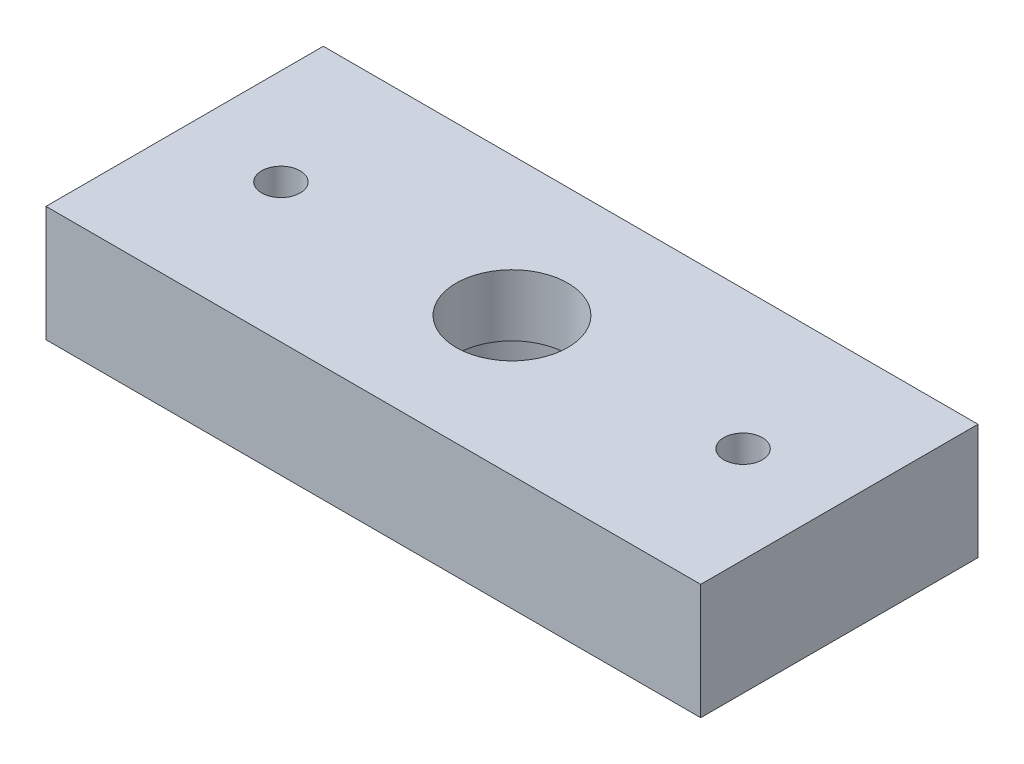
ISO-10303-21;
HEADER;
FILE_DESCRIPTION(('STEP AP214'),'2;1');
FILE_NAME('part.step','',(''),(''),'','','');
FILE_SCHEMA(('AUTOMOTIVE_DESIGN { 1 0 10303 214 1 1 1 1 }'));
ENDSEC;
DATA;
#1=APPLICATION_CONTEXT('core data for automotive mechanical design processes');
#2=APPLICATION_PROTOCOL_DEFINITION('international standard','automotive_design',2000,#1);
#3=PRODUCT_CONTEXT('',#1,'mechanical');
#4=PRODUCT('Part','Part','',(#3));
#5=PRODUCT_RELATED_PRODUCT_CATEGORY('part','',(#4));
#6=PRODUCT_DEFINITION_FORMATION('','',#4);
#7=PRODUCT_DEFINITION_CONTEXT('part definition',#1,'design');
#8=PRODUCT_DEFINITION('design','',#6,#7);
#9=PRODUCT_DEFINITION_SHAPE('','',#8);
#10=(LENGTH_UNIT() NAMED_UNIT(*) SI_UNIT(.MILLI.,.METRE.));
#11=(NAMED_UNIT(*) PLANE_ANGLE_UNIT() SI_UNIT($,.RADIAN.));
#12=(NAMED_UNIT(*) SI_UNIT($,.STERADIAN.) SOLID_ANGLE_UNIT());
#13=UNCERTAINTY_MEASURE_WITH_UNIT(LENGTH_MEASURE(1.E-05),#10,'distance_accuracy_value','');
#14=(GEOMETRIC_REPRESENTATION_CONTEXT(3) GLOBAL_UNCERTAINTY_ASSIGNED_CONTEXT((#13)) GLOBAL_UNIT_ASSIGNED_CONTEXT((#10,
#11,#12)) REPRESENTATION_CONTEXT('',''));
#15=CARTESIAN_POINT('',(0.,0.,0.));
#16=DIRECTION('',(0.,0.,1.));
#17=DIRECTION('',(1.,0.,0.));
#18=AXIS2_PLACEMENT_3D('',#15,#16,#17);
#19=CARTESIAN_POINT('',(42.5,15.,0.));
#20=DIRECTION('',(1.,0.,0.));
#21=DIRECTION('',(0.,0.,-1.));
#22=AXIS2_PLACEMENT_3D('',#19,#20,#21);
#23=PLANE('',#22);
#24=DIRECTION('',(0.,0.,1.));
#25=VECTOR('',#24,1.);
#26=CARTESIAN_POINT('',(42.5,0.,0.));
#27=LINE('',#26,#25);
#28=CARTESIAN_POINT('',(42.5,0.,-18.));
#29=VERTEX_POINT('',#28);
#30=CARTESIAN_POINT('',(42.5,0.,18.));
#31=VERTEX_POINT('',#30);
#32=EDGE_CURVE('E117',#29,#31,#27,.T.);
#33=ORIENTED_EDGE('',*,*,#32,.F.);
#34=DIRECTION('',(0.,-1.,0.));
#35=VECTOR('',#34,1.);
#36=CARTESIAN_POINT('',(42.5,15.,-18.));
#37=LINE('',#36,#35);
#38=CARTESIAN_POINT('',(42.5,15.,-18.));
#39=VERTEX_POINT('',#38);
#40=EDGE_CURVE('E11',#39,#29,#37,.T.);
#41=ORIENTED_EDGE('',*,*,#40,.F.);
#42=DIRECTION('',(0.,0.,1.));
#43=VECTOR('',#42,1.);
#44=CARTESIAN_POINT('',(42.5,15.,0.));
#45=LINE('',#44,#43);
#46=CARTESIAN_POINT('',(42.5,15.,18.));
#47=VERTEX_POINT('',#46);
#48=EDGE_CURVE('E101',#39,#47,#45,.T.);
#49=ORIENTED_EDGE('',*,*,#48,.T.);
#50=DIRECTION('',(0.,-1.,0.));
#51=VECTOR('',#50,1.);
#52=CARTESIAN_POINT('',(42.5,15.,18.));
#53=LINE('',#52,#51);
#54=EDGE_CURVE('E80',#47,#31,#53,.T.);
#55=ORIENTED_EDGE('',*,*,#54,.T.);
#56=EDGE_LOOP('',(#33,#41,#49,#55));
#57=FACE_BOUND('',#56,.T.);
#58=ADVANCED_FACE('F41',(#57),#23,.T.);
#59=CARTESIAN_POINT('',(0.,15.,-18.));
#60=DIRECTION('',(0.,0.,-1.));
#61=DIRECTION('',(-1.,0.,0.));
#62=AXIS2_PLACEMENT_3D('',#59,#60,#61);
#63=PLANE('',#62);
#64=DIRECTION('',(1.,0.,0.));
#65=VECTOR('',#64,1.);
#66=CARTESIAN_POINT('',(0.,0.,-18.));
#67=LINE('',#66,#65);
#68=CARTESIAN_POINT('',(-42.5,0.,-18.));
#69=VERTEX_POINT('',#68);
#70=EDGE_CURVE('E93',#69,#29,#67,.T.);
#71=ORIENTED_EDGE('',*,*,#70,.F.);
#72=DIRECTION('',(0.,-1.,0.));
#73=VECTOR('',#72,1.);
#74=CARTESIAN_POINT('',(-42.5,15.,-18.));
#75=LINE('',#74,#73);
#76=CARTESIAN_POINT('',(-42.5,15.,-18.));
#77=VERTEX_POINT('',#76);
#78=EDGE_CURVE('E50',#77,#69,#75,.T.);
#79=ORIENTED_EDGE('',*,*,#78,.F.);
#80=DIRECTION('',(1.,0.,0.));
#81=VECTOR('',#80,1.);
#82=CARTESIAN_POINT('',(0.,15.,-18.));
#83=LINE('',#82,#81);
#84=EDGE_CURVE('E91',#77,#39,#83,.T.);
#85=ORIENTED_EDGE('',*,*,#84,.T.);
#86=ORIENTED_EDGE('',*,*,#40,.T.);
#87=EDGE_LOOP('',(#71,#79,#85,#86));
#88=FACE_BOUND('',#87,.T.);
#89=ADVANCED_FACE('F89',(#88),#63,.T.);
#90=CARTESIAN_POINT('',(-42.5,15.,0.));
#91=DIRECTION('',(1.,0.,0.));
#92=DIRECTION('',(0.,0.,-1.));
#93=AXIS2_PLACEMENT_3D('',#90,#91,#92);
#94=PLANE('',#93);
#95=DIRECTION('',(0.,0.,1.));
#96=VECTOR('',#95,1.);
#97=CARTESIAN_POINT('',(-42.5,0.,0.));
#98=LINE('',#97,#96);
#99=CARTESIAN_POINT('',(-42.5,0.,18.));
#100=VERTEX_POINT('',#99);
#101=EDGE_CURVE('E73',#69,#100,#98,.T.);
#102=ORIENTED_EDGE('',*,*,#101,.T.);
#103=DIRECTION('',(0.,-1.,0.));
#104=VECTOR('',#103,1.);
#105=CARTESIAN_POINT('',(-42.5,15.,18.));
#106=LINE('',#105,#104);
#107=CARTESIAN_POINT('',(-42.5,15.,18.));
#108=VERTEX_POINT('',#107);
#109=EDGE_CURVE('E94',#108,#100,#106,.T.);
#110=ORIENTED_EDGE('',*,*,#109,.F.);
#111=DIRECTION('',(0.,0.,1.));
#112=VECTOR('',#111,1.);
#113=CARTESIAN_POINT('',(-42.5,15.,0.));
#114=LINE('',#113,#112);
#115=EDGE_CURVE('E96',#77,#108,#114,.T.);
#116=ORIENTED_EDGE('',*,*,#115,.F.);
#117=ORIENTED_EDGE('',*,*,#78,.T.);
#118=EDGE_LOOP('',(#102,#110,#116,#117));
#119=FACE_BOUND('',#118,.T.);
#120=ADVANCED_FACE('F97',(#119),#94,.F.);
#121=CARTESIAN_POINT('',(-30.,15.,0.));
#122=DIRECTION('',(0.,-1.,0.));
#123=DIRECTION('',(0.,0.,-1.));
#124=AXIS2_PLACEMENT_3D('',#121,#122,#123);
#125=CYLINDRICAL_SURFACE('',#124,2.5);
#126=CARTESIAN_POINT('',(-30.,15.,0.));
#127=DIRECTION('',(0.,1.,0.));
#128=DIRECTION('',(0.,0.,1.));
#129=AXIS2_PLACEMENT_3D('',#126,#127,#128);
#130=CIRCLE('',#129,2.5);
#131=CARTESIAN_POINT('',(-30.,15.,2.50000000000001));
#132=VERTEX_POINT('',#131);
#133=EDGE_CURVE('E111',#132,#132,#130,.T.);
#134=ORIENTED_EDGE('',*,*,#133,.T.);
#135=EDGE_LOOP('',(#134));
#136=FACE_BOUND('',#135,.T.);
#137=CARTESIAN_POINT('',(-30.,0.,0.));
#138=DIRECTION('',(0.,1.,0.));
#139=DIRECTION('',(0.,0.,1.));
#140=AXIS2_PLACEMENT_3D('',#137,#138,#139);
#141=CIRCLE('',#140,2.5);
#142=CARTESIAN_POINT('',(-30.,0.,2.50000000000001));
#143=VERTEX_POINT('',#142);
#144=EDGE_CURVE('E124',#143,#143,#141,.T.);
#145=ORIENTED_EDGE('',*,*,#144,.F.);
#146=EDGE_LOOP('',(#145));
#147=FACE_BOUND('',#146,.T.);
#148=ADVANCED_FACE('F143',(#136,#147),#125,.F.);
#149=CARTESIAN_POINT('',(0.,15.,0.));
#150=DIRECTION('',(0.,-1.,0.));
#151=DIRECTION('',(0.,0.,-1.));
#152=AXIS2_PLACEMENT_3D('',#149,#150,#151);
#153=CYLINDRICAL_SURFACE('',#152,7.25);
#154=CARTESIAN_POINT('',(0.,7.,0.));
#155=DIRECTION('',(0.,1.,0.));
#156=DIRECTION('',(0.,0.,1.));
#157=AXIS2_PLACEMENT_3D('',#154,#155,#156);
#158=CIRCLE('',#157,7.25);
#159=CARTESIAN_POINT('',(0.,7.,7.25));
#160=VERTEX_POINT('',#159);
#161=EDGE_CURVE('E44',#160,#160,#158,.T.);
#162=ORIENTED_EDGE('',*,*,#161,.F.);
#163=EDGE_LOOP('',(#162));
#164=FACE_BOUND('',#163,.T.);
#165=CARTESIAN_POINT('',(0.,15.,0.));
#166=DIRECTION('',(0.,1.,0.));
#167=DIRECTION('',(0.,0.,1.));
#168=AXIS2_PLACEMENT_3D('',#165,#166,#167);
#169=CIRCLE('',#168,7.25);
#170=CARTESIAN_POINT('',(0.,15.,7.25));
#171=VERTEX_POINT('',#170);
#172=EDGE_CURVE('E108',#171,#171,#169,.T.);
#173=ORIENTED_EDGE('',*,*,#172,.T.);
#174=EDGE_LOOP('',(#173));
#175=FACE_BOUND('',#174,.T.);
#176=ADVANCED_FACE('F149',(#164,#175),#153,.F.);
#177=CARTESIAN_POINT('',(0.,15.,18.));
#178=DIRECTION('',(0.,0.,-1.));
#179=DIRECTION('',(-1.,0.,0.));
#180=AXIS2_PLACEMENT_3D('',#177,#178,#179);
#181=PLANE('',#180);
#182=DIRECTION('',(1.,0.,0.));
#183=VECTOR('',#182,1.);
#184=CARTESIAN_POINT('',(0.,0.,18.));
#185=LINE('',#184,#183);
#186=EDGE_CURVE('E122',#100,#31,#185,.T.);
#187=ORIENTED_EDGE('',*,*,#186,.T.);
#188=ORIENTED_EDGE('',*,*,#54,.F.);
#189=DIRECTION('',(1.,0.,0.));
#190=VECTOR('',#189,1.);
#191=CARTESIAN_POINT('',(0.,15.,18.));
#192=LINE('',#191,#190);
#193=EDGE_CURVE('E58',#108,#47,#192,.T.);
#194=ORIENTED_EDGE('',*,*,#193,.F.);
#195=ORIENTED_EDGE('',*,*,#109,.T.);
#196=EDGE_LOOP('',(#187,#188,#194,#195));
#197=FACE_BOUND('',#196,.T.);
#198=ADVANCED_FACE('F132',(#197),#181,.F.);
#199=CARTESIAN_POINT('',(30.,15.,0.));
#200=DIRECTION('',(0.,-1.,0.));
#201=DIRECTION('',(0.,0.,-1.));
#202=AXIS2_PLACEMENT_3D('',#199,#200,#201);
#203=CYLINDRICAL_SURFACE('',#202,2.5);
#204=CARTESIAN_POINT('',(30.,15.,0.));
#205=DIRECTION('',(0.,1.,0.));
#206=DIRECTION('',(0.,0.,1.));
#207=AXIS2_PLACEMENT_3D('',#204,#205,#206);
#208=CIRCLE('',#207,2.5);
#209=CARTESIAN_POINT('',(30.,15.,2.50000000000001));
#210=VERTEX_POINT('',#209);
#211=EDGE_CURVE('E114',#210,#210,#208,.F.);
#212=ORIENTED_EDGE('',*,*,#211,.F.);
#213=EDGE_LOOP('',(#212));
#214=FACE_BOUND('',#213,.T.);
#215=CARTESIAN_POINT('',(30.,0.,0.));
#216=DIRECTION('',(0.,1.,0.));
#217=DIRECTION('',(0.,0.,1.));
#218=AXIS2_PLACEMENT_3D('',#215,#216,#217);
#219=CIRCLE('',#218,2.5);
#220=CARTESIAN_POINT('',(30.,0.,2.50000000000001));
#221=VERTEX_POINT('',#220);
#222=EDGE_CURVE('E103',#221,#221,#219,.F.);
#223=ORIENTED_EDGE('',*,*,#222,.T.);
#224=EDGE_LOOP('',(#223));
#225=FACE_BOUND('',#224,.T.);
#226=ADVANCED_FACE('F148',(#214,#225),#203,.F.);
#227=CARTESIAN_POINT('',(0.,15.,0.));
#228=DIRECTION('',(0.,1.,0.));
#229=DIRECTION('',(0.,0.,1.));
#230=AXIS2_PLACEMENT_3D('',#227,#228,#229);
#231=PLANE('',#230);
#232=ORIENTED_EDGE('',*,*,#48,.F.);
#233=ORIENTED_EDGE('',*,*,#84,.F.);
#234=ORIENTED_EDGE('',*,*,#115,.T.);
#235=ORIENTED_EDGE('',*,*,#193,.T.);
#236=EDGE_LOOP('',(#232,#233,#234,#235));
#237=FACE_BOUND('',#236,.T.);
#238=ORIENTED_EDGE('',*,*,#172,.F.);
#239=EDGE_LOOP('',(#238));
#240=FACE_BOUND('',#239,.T.);
#241=ORIENTED_EDGE('',*,*,#133,.F.);
#242=EDGE_LOOP('',(#241));
#243=FACE_BOUND('',#242,.T.);
#244=ORIENTED_EDGE('',*,*,#211,.T.);
#245=EDGE_LOOP('',(#244));
#246=FACE_BOUND('',#245,.T.);
#247=ADVANCED_FACE('F99',(#237,#240,#243,#246),#231,.T.);
#248=CARTESIAN_POINT('',(0.,0.,0.));
#249=DIRECTION('',(0.,1.,0.));
#250=DIRECTION('',(0.,0.,1.));
#251=AXIS2_PLACEMENT_3D('',#248,#249,#250);
#252=PLANE('',#251);
#253=CARTESIAN_POINT('',(0.,0.,0.));
#254=DIRECTION('',(0.,1.,0.));
#255=DIRECTION('',(0.,0.,1.));
#256=AXIS2_PLACEMENT_3D('',#253,#254,#255);
#257=CIRCLE('',#256,11.);
#258=CARTESIAN_POINT('',(0.,0.,11.));
#259=VERTEX_POINT('',#258);
#260=EDGE_CURVE('E179',#259,#259,#257,.T.);
#261=ORIENTED_EDGE('',*,*,#260,.T.);
#262=EDGE_LOOP('',(#261));
#263=FACE_BOUND('',#262,.T.);
#264=ORIENTED_EDGE('',*,*,#32,.T.);
#265=ORIENTED_EDGE('',*,*,#186,.F.);
#266=ORIENTED_EDGE('',*,*,#101,.F.);
#267=ORIENTED_EDGE('',*,*,#70,.T.);
#268=EDGE_LOOP('',(#264,#265,#266,#267));
#269=FACE_BOUND('',#268,.T.);
#270=ORIENTED_EDGE('',*,*,#144,.T.);
#271=EDGE_LOOP('',(#270));
#272=FACE_BOUND('',#271,.T.);
#273=ORIENTED_EDGE('',*,*,#222,.F.);
#274=EDGE_LOOP('',(#273));
#275=FACE_BOUND('',#274,.T.);
#276=ADVANCED_FACE('F134',(#263,#269,#272,#275),#252,.F.);
#277=CARTESIAN_POINT('',(0.,7.,0.));
#278=DIRECTION('',(0.,-1.,0.));
#279=DIRECTION('',(0.,0.,-1.));
#280=AXIS2_PLACEMENT_3D('',#277,#278,#279);
#281=CYLINDRICAL_SURFACE('',#280,11.);
#282=CARTESIAN_POINT('',(0.,7.,0.));
#283=DIRECTION('',(0.,1.,0.));
#284=DIRECTION('',(0.,0.,1.));
#285=AXIS2_PLACEMENT_3D('',#282,#283,#284);
#286=CIRCLE('',#285,11.);
#287=CARTESIAN_POINT('',(0.,7.,11.));
#288=VERTEX_POINT('',#287);
#289=EDGE_CURVE('E178',#288,#288,#286,.T.);
#290=ORIENTED_EDGE('',*,*,#289,.T.);
#291=EDGE_LOOP('',(#290));
#292=FACE_BOUND('',#291,.T.);
#293=ORIENTED_EDGE('',*,*,#260,.F.);
#294=EDGE_LOOP('',(#293));
#295=FACE_BOUND('',#294,.T.);
#296=ADVANCED_FACE('F161',(#292,#295),#281,.F.);
#297=CARTESIAN_POINT('',(0.,7.,0.));
#298=DIRECTION('',(0.,1.,0.));
#299=DIRECTION('',(0.,0.,1.));
#300=AXIS2_PLACEMENT_3D('',#297,#298,#299);
#301=PLANE('',#300);
#302=ORIENTED_EDGE('',*,*,#161,.T.);
#303=EDGE_LOOP('',(#302));
#304=FACE_BOUND('',#303,.T.);
#305=ORIENTED_EDGE('',*,*,#289,.F.);
#306=EDGE_LOOP('',(#305));
#307=FACE_BOUND('',#306,.T.);
#308=ADVANCED_FACE('F167',(#304,#307),#301,.F.);
#309=CLOSED_SHELL('',(#58,#89,#120,#148,#176,#198,#226,#247,#276,#296,#308));
#310=MANIFOLD_SOLID_BREP('B2',#309);
#311=ADVANCED_BREP_SHAPE_REPRESENTATION('',(#18,#310),#14);
#312=SHAPE_DEFINITION_REPRESENTATION(#9,#311);
ENDSEC;
END-ISO-10303-21;
